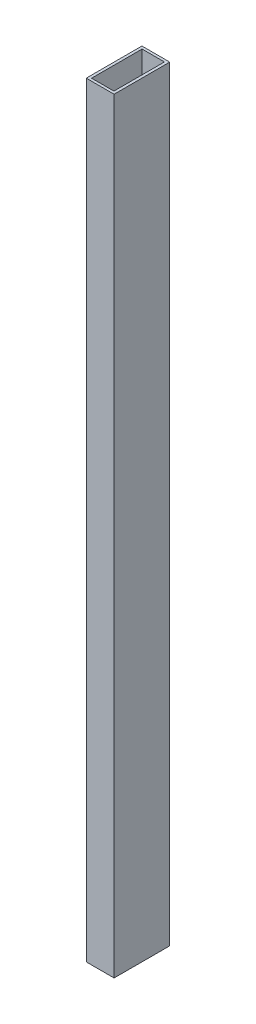
ISO-10303-21;
HEADER;
FILE_DESCRIPTION(('STEP AP214'),'2;1');
FILE_NAME('part.step','',(''),(''),'','','');
FILE_SCHEMA(('AUTOMOTIVE_DESIGN { 1 0 10303 214 1 1 1 1 }'));
ENDSEC;
DATA;
#1=APPLICATION_CONTEXT('core data for automotive mechanical design processes');
#2=APPLICATION_PROTOCOL_DEFINITION('international standard','automotive_design',2000,#1);
#3=PRODUCT_CONTEXT('',#1,'mechanical');
#4=PRODUCT('Part','Part','',(#3));
#5=PRODUCT_RELATED_PRODUCT_CATEGORY('part','',(#4));
#6=PRODUCT_DEFINITION_FORMATION('','',#4);
#7=PRODUCT_DEFINITION_CONTEXT('part definition',#1,'design');
#8=PRODUCT_DEFINITION('design','',#6,#7);
#9=PRODUCT_DEFINITION_SHAPE('','',#8);
#10=(LENGTH_UNIT() NAMED_UNIT(*) SI_UNIT(.MILLI.,.METRE.));
#11=(NAMED_UNIT(*) PLANE_ANGLE_UNIT() SI_UNIT($,.RADIAN.));
#12=(NAMED_UNIT(*) SI_UNIT($,.STERADIAN.) SOLID_ANGLE_UNIT());
#13=UNCERTAINTY_MEASURE_WITH_UNIT(LENGTH_MEASURE(1.E-05),#10,'distance_accuracy_value','');
#14=(GEOMETRIC_REPRESENTATION_CONTEXT(3) GLOBAL_UNCERTAINTY_ASSIGNED_CONTEXT((#13)) GLOBAL_UNIT_ASSIGNED_CONTEXT((#10,
#11,#12)) REPRESENTATION_CONTEXT('',''));
#15=CARTESIAN_POINT('',(0.,0.,0.));
#16=DIRECTION('',(0.,0.,1.));
#17=DIRECTION('',(1.,0.,0.));
#18=AXIS2_PLACEMENT_3D('',#15,#16,#17);
#19=CARTESIAN_POINT('',(0.,698.5,0.));
#20=DIRECTION('',(0.,-1.,0.));
#21=DIRECTION('',(0.,0.,-1.));
#22=AXIS2_PLACEMENT_3D('',#19,#20,#21);
#23=PLANE('',#22);
#24=DIRECTION('',(0.,0.,-1.));
#25=VECTOR('',#24,1.);
#26=CARTESIAN_POINT('',(15.4285360824743,698.5,25.104006109202));
#27=LINE('',#26,#25);
#28=CARTESIAN_POINT('',(15.4285360824743,698.5,25.104006109202));
#29=VERTEX_POINT('',#28);
#30=CARTESIAN_POINT('',(15.4285360824743,698.5,-25.695993890798));
#31=VERTEX_POINT('',#30);
#32=EDGE_CURVE('E173',#29,#31,#27,.T.);
#33=ORIENTED_EDGE('',*,*,#32,.T.);
#34=DIRECTION('',(-1.,0.,0.));
#35=VECTOR('',#34,1.);
#36=CARTESIAN_POINT('',(-9.97146391752574,698.5,-25.695993890798));
#37=LINE('',#36,#35);
#38=CARTESIAN_POINT('',(-9.97146391752574,698.5,-25.695993890798));
#39=VERTEX_POINT('',#38);
#40=EDGE_CURVE('E120',#31,#39,#37,.T.);
#41=ORIENTED_EDGE('',*,*,#40,.T.);
#42=DIRECTION('',(0.,0.,1.));
#43=VECTOR('',#42,1.);
#44=CARTESIAN_POINT('',(-9.97146391752574,698.5,25.104006109202));
#45=LINE('',#44,#43);
#46=CARTESIAN_POINT('',(-9.97146391752574,698.5,25.104006109202));
#47=VERTEX_POINT('',#46);
#48=EDGE_CURVE('E176',#39,#47,#45,.T.);
#49=ORIENTED_EDGE('',*,*,#48,.T.);
#50=DIRECTION('',(1.,0.,0.));
#51=VECTOR('',#50,1.);
#52=CARTESIAN_POINT('',(-9.97146391752574,698.5,25.104006109202));
#53=LINE('',#52,#51);
#54=EDGE_CURVE('E91',#47,#29,#53,.T.);
#55=ORIENTED_EDGE('',*,*,#54,.T.);
#56=EDGE_LOOP('',(#33,#41,#49,#55));
#57=FACE_BOUND('',#56,.T.);
#58=DIRECTION('',(0.,0.,-1.));
#59=VECTOR('',#58,1.);
#60=CARTESIAN_POINT('',(12.9079329813631,698.5,0.));
#61=LINE('',#60,#59);
#62=CARTESIAN_POINT('',(12.9079329813631,698.5,22.7317882900888));
#63=VERTEX_POINT('',#62);
#64=CARTESIAN_POINT('',(12.9079329813631,698.5,-23.3858455277616));
#65=VERTEX_POINT('',#64);
#66=EDGE_CURVE('E12',#63,#65,#61,.T.);
#67=ORIENTED_EDGE('',*,*,#66,.F.);
#68=DIRECTION('',(1.,0.,0.));
#69=VECTOR('',#68,1.);
#70=CARTESIAN_POINT('',(0.,698.5,22.7317882900888));
#71=LINE('',#70,#69);
#72=CARTESIAN_POINT('',(-7.51293012600225,698.5,22.7317882900888));
#73=VERTEX_POINT('',#72);
#74=EDGE_CURVE('E196',#73,#63,#71,.T.);
#75=ORIENTED_EDGE('',*,*,#74,.F.);
#76=DIRECTION('',(0.,0.,1.));
#77=VECTOR('',#76,1.);
#78=CARTESIAN_POINT('',(-7.51293012600225,698.5,0.));
#79=LINE('',#78,#77);
#80=CARTESIAN_POINT('',(-7.51293012600225,698.5,-23.3858455277616));
#81=VERTEX_POINT('',#80);
#82=EDGE_CURVE('E198',#81,#73,#79,.T.);
#83=ORIENTED_EDGE('',*,*,#82,.F.);
#84=DIRECTION('',(-1.,0.,0.));
#85=VECTOR('',#84,1.);
#86=CARTESIAN_POINT('',(0.,698.5,-23.3858455277616));
#87=LINE('',#86,#85);
#88=EDGE_CURVE('E73',#65,#81,#87,.T.);
#89=ORIENTED_EDGE('',*,*,#88,.F.);
#90=EDGE_LOOP('',(#67,#75,#83,#89));
#91=FACE_BOUND('',#90,.T.);
#92=ADVANCED_FACE('F65',(#57,#91),#23,.F.);
#93=CARTESIAN_POINT('',(15.4285360824743,698.5,25.104006109202));
#94=DIRECTION('',(-1.,0.,0.));
#95=DIRECTION('',(0.,0.,1.));
#96=AXIS2_PLACEMENT_3D('',#93,#94,#95);
#97=PLANE('',#96);
#98=DIRECTION('',(0.,0.,-1.));
#99=VECTOR('',#98,1.);
#100=CARTESIAN_POINT('',(15.4285360824743,0.,25.104006109202));
#101=LINE('',#100,#99);
#102=CARTESIAN_POINT('',(15.4285360824743,0.,25.104006109202));
#103=VERTEX_POINT('',#102);
#104=CARTESIAN_POINT('',(15.4285360824743,0.,-25.695993890798));
#105=VERTEX_POINT('',#104);
#106=EDGE_CURVE('E151',#103,#105,#101,.T.);
#107=ORIENTED_EDGE('',*,*,#106,.T.);
#108=DIRECTION('',(0.,-1.,0.));
#109=VECTOR('',#108,1.);
#110=CARTESIAN_POINT('',(15.4285360824743,698.5,-25.695993890798));
#111=LINE('',#110,#109);
#112=EDGE_CURVE('E194',#31,#105,#111,.T.);
#113=ORIENTED_EDGE('',*,*,#112,.F.);
#114=ORIENTED_EDGE('',*,*,#32,.F.);
#115=DIRECTION('',(0.,-1.,0.));
#116=VECTOR('',#115,1.);
#117=CARTESIAN_POINT('',(15.4285360824743,698.5,25.104006109202));
#118=LINE('',#117,#116);
#119=EDGE_CURVE('E179',#29,#103,#118,.T.);
#120=ORIENTED_EDGE('',*,*,#119,.T.);
#121=EDGE_LOOP('',(#107,#113,#114,#120));
#122=FACE_BOUND('',#121,.T.);
#123=ADVANCED_FACE('F67',(#122),#97,.F.);
#124=CARTESIAN_POINT('',(-9.97146391752574,698.5,-25.695993890798));
#125=DIRECTION('',(0.,0.,1.));
#126=DIRECTION('',(1.,0.,0.));
#127=AXIS2_PLACEMENT_3D('',#124,#125,#126);
#128=PLANE('',#127);
#129=DIRECTION('',(-1.,0.,0.));
#130=VECTOR('',#129,1.);
#131=CARTESIAN_POINT('',(-9.97146391752574,0.,-25.695993890798));
#132=LINE('',#131,#130);
#133=CARTESIAN_POINT('',(-9.97146391752574,0.,-25.695993890798));
#134=VERTEX_POINT('',#133);
#135=EDGE_CURVE('E182',#105,#134,#132,.T.);
#136=ORIENTED_EDGE('',*,*,#135,.T.);
#137=DIRECTION('',(0.,-1.,0.));
#138=VECTOR('',#137,1.);
#139=CARTESIAN_POINT('',(-9.97146391752574,698.5,-25.695993890798));
#140=LINE('',#139,#138);
#141=EDGE_CURVE('E191',#39,#134,#140,.T.);
#142=ORIENTED_EDGE('',*,*,#141,.F.);
#143=ORIENTED_EDGE('',*,*,#40,.F.);
#144=ORIENTED_EDGE('',*,*,#112,.T.);
#145=EDGE_LOOP('',(#136,#142,#143,#144));
#146=FACE_BOUND('',#145,.T.);
#147=ADVANCED_FACE('F218',(#146),#128,.F.);
#148=CARTESIAN_POINT('',(-9.97146391752574,698.5,25.104006109202));
#149=DIRECTION('',(1.,0.,0.));
#150=DIRECTION('',(0.,0.,-1.));
#151=AXIS2_PLACEMENT_3D('',#148,#149,#150);
#152=PLANE('',#151);
#153=DIRECTION('',(0.,0.,1.));
#154=VECTOR('',#153,1.);
#155=CARTESIAN_POINT('',(-9.97146391752574,0.,25.104006109202));
#156=LINE('',#155,#154);
#157=CARTESIAN_POINT('',(-9.97146391752574,0.,25.104006109202));
#158=VERTEX_POINT('',#157);
#159=EDGE_CURVE('E184',#134,#158,#156,.T.);
#160=ORIENTED_EDGE('',*,*,#159,.T.);
#161=DIRECTION('',(0.,-1.,0.));
#162=VECTOR('',#161,1.);
#163=CARTESIAN_POINT('',(-9.97146391752574,698.5,25.104006109202));
#164=LINE('',#163,#162);
#165=EDGE_CURVE('E189',#47,#158,#164,.T.);
#166=ORIENTED_EDGE('',*,*,#165,.F.);
#167=ORIENTED_EDGE('',*,*,#48,.F.);
#168=ORIENTED_EDGE('',*,*,#141,.T.);
#169=EDGE_LOOP('',(#160,#166,#167,#168));
#170=FACE_BOUND('',#169,.T.);
#171=ADVANCED_FACE('F230',(#170),#152,.F.);
#172=CARTESIAN_POINT('',(-9.97146391752574,698.5,25.104006109202));
#173=DIRECTION('',(0.,0.,-1.));
#174=DIRECTION('',(-1.,0.,0.));
#175=AXIS2_PLACEMENT_3D('',#172,#173,#174);
#176=PLANE('',#175);
#177=DIRECTION('',(1.,0.,0.));
#178=VECTOR('',#177,1.);
#179=CARTESIAN_POINT('',(-9.97146391752574,0.,25.104006109202));
#180=LINE('',#179,#178);
#181=EDGE_CURVE('E112',#158,#103,#180,.T.);
#182=ORIENTED_EDGE('',*,*,#181,.T.);
#183=ORIENTED_EDGE('',*,*,#119,.F.);
#184=ORIENTED_EDGE('',*,*,#54,.F.);
#185=ORIENTED_EDGE('',*,*,#165,.T.);
#186=EDGE_LOOP('',(#182,#183,#184,#185));
#187=FACE_BOUND('',#186,.T.);
#188=ADVANCED_FACE('F226',(#187),#176,.F.);
#189=CARTESIAN_POINT('',(0.,0.,0.));
#190=DIRECTION('',(0.,-1.,0.));
#191=DIRECTION('',(0.,0.,-1.));
#192=AXIS2_PLACEMENT_3D('',#189,#190,#191);
#193=PLANE('',#192);
#194=ORIENTED_EDGE('',*,*,#106,.F.);
#195=ORIENTED_EDGE('',*,*,#181,.F.);
#196=ORIENTED_EDGE('',*,*,#159,.F.);
#197=ORIENTED_EDGE('',*,*,#135,.F.);
#198=EDGE_LOOP('',(#194,#195,#196,#197));
#199=FACE_BOUND('',#198,.T.);
#200=ADVANCED_FACE('F223',(#199),#193,.T.);
#201=CARTESIAN_POINT('',(12.9079329813631,708.5,22.7317882900888));
#202=DIRECTION('',(-1.,0.,0.));
#203=DIRECTION('',(0.,0.,1.));
#204=AXIS2_PLACEMENT_3D('',#201,#202,#203);
#205=PLANE('',#204);
#206=ORIENTED_EDGE('',*,*,#66,.T.);
#207=DIRECTION('',(0.,-1.,0.));
#208=VECTOR('',#207,1.);
#209=CARTESIAN_POINT('',(12.9079329813631,708.5,-23.3858455277616));
#210=LINE('',#209,#208);
#211=CARTESIAN_POINT('',(12.9079329813631,190.5,-23.3858455277616));
#212=VERTEX_POINT('',#211);
#213=EDGE_CURVE('E141',#65,#212,#210,.T.);
#214=ORIENTED_EDGE('',*,*,#213,.T.);
#215=DIRECTION('',(0.,0.,-1.));
#216=VECTOR('',#215,1.);
#217=CARTESIAN_POINT('',(12.9079329813631,190.5,22.7317882900888));
#218=LINE('',#217,#216);
#219=CARTESIAN_POINT('',(12.9079329813631,190.5,22.7317882900888));
#220=VERTEX_POINT('',#219);
#221=EDGE_CURVE('E146',#220,#212,#218,.T.);
#222=ORIENTED_EDGE('',*,*,#221,.F.);
#223=DIRECTION('',(0.,-1.,0.));
#224=VECTOR('',#223,1.);
#225=CARTESIAN_POINT('',(12.9079329813631,708.5,22.7317882900888));
#226=LINE('',#225,#224);
#227=EDGE_CURVE('E169',#63,#220,#226,.T.);
#228=ORIENTED_EDGE('',*,*,#227,.F.);
#229=EDGE_LOOP('',(#206,#214,#222,#228));
#230=FACE_BOUND('',#229,.T.);
#231=ADVANCED_FACE('F143',(#230),#205,.T.);
#232=CARTESIAN_POINT('',(-7.51293012600225,708.5,-23.3858455277616));
#233=DIRECTION('',(0.,0.,1.));
#234=DIRECTION('',(1.,0.,0.));
#235=AXIS2_PLACEMENT_3D('',#232,#233,#234);
#236=PLANE('',#235);
#237=ORIENTED_EDGE('',*,*,#88,.T.);
#238=DIRECTION('',(0.,-1.,0.));
#239=VECTOR('',#238,1.);
#240=CARTESIAN_POINT('',(-7.51293012600225,708.5,-23.3858455277616));
#241=LINE('',#240,#239);
#242=CARTESIAN_POINT('',(-7.51293012600225,190.5,-23.3858455277616));
#243=VERTEX_POINT('',#242);
#244=EDGE_CURVE('E152',#81,#243,#241,.T.);
#245=ORIENTED_EDGE('',*,*,#244,.T.);
#246=DIRECTION('',(-1.,0.,0.));
#247=VECTOR('',#246,1.);
#248=CARTESIAN_POINT('',(-7.51293012600225,190.5,-23.3858455277616));
#249=LINE('',#248,#247);
#250=EDGE_CURVE('E155',#212,#243,#249,.T.);
#251=ORIENTED_EDGE('',*,*,#250,.F.);
#252=ORIENTED_EDGE('',*,*,#213,.F.);
#253=EDGE_LOOP('',(#237,#245,#251,#252));
#254=FACE_BOUND('',#253,.T.);
#255=ADVANCED_FACE('F156',(#254),#236,.T.);
#256=CARTESIAN_POINT('',(-7.51293012600225,708.5,22.7317882900888));
#257=DIRECTION('',(1.,0.,0.));
#258=DIRECTION('',(0.,0.,-1.));
#259=AXIS2_PLACEMENT_3D('',#256,#257,#258);
#260=PLANE('',#259);
#261=ORIENTED_EDGE('',*,*,#82,.T.);
#262=DIRECTION('',(0.,-1.,0.));
#263=VECTOR('',#262,1.);
#264=CARTESIAN_POINT('',(-7.51293012600225,708.5,22.7317882900888));
#265=LINE('',#264,#263);
#266=CARTESIAN_POINT('',(-7.51293012600225,190.5,22.7317882900888));
#267=VERTEX_POINT('',#266);
#268=EDGE_CURVE('E80',#73,#267,#265,.T.);
#269=ORIENTED_EDGE('',*,*,#268,.T.);
#270=DIRECTION('',(0.,0.,1.));
#271=VECTOR('',#270,1.);
#272=CARTESIAN_POINT('',(-7.51293012600225,190.5,22.7317882900888));
#273=LINE('',#272,#271);
#274=EDGE_CURVE('E161',#243,#267,#273,.T.);
#275=ORIENTED_EDGE('',*,*,#274,.F.);
#276=ORIENTED_EDGE('',*,*,#244,.F.);
#277=EDGE_LOOP('',(#261,#269,#275,#276));
#278=FACE_BOUND('',#277,.T.);
#279=ADVANCED_FACE('F202',(#278),#260,.T.);
#280=CARTESIAN_POINT('',(-7.51293012600225,708.5,22.7317882900888));
#281=DIRECTION('',(0.,0.,-1.));
#282=DIRECTION('',(-1.,0.,0.));
#283=AXIS2_PLACEMENT_3D('',#280,#281,#282);
#284=PLANE('',#283);
#285=ORIENTED_EDGE('',*,*,#74,.T.);
#286=ORIENTED_EDGE('',*,*,#227,.T.);
#287=DIRECTION('',(1.,0.,0.));
#288=VECTOR('',#287,1.);
#289=CARTESIAN_POINT('',(-7.51293012600225,190.5,22.7317882900888));
#290=LINE('',#289,#288);
#291=EDGE_CURVE('E164',#267,#220,#290,.T.);
#292=ORIENTED_EDGE('',*,*,#291,.F.);
#293=ORIENTED_EDGE('',*,*,#268,.F.);
#294=EDGE_LOOP('',(#285,#286,#292,#293));
#295=FACE_BOUND('',#294,.T.);
#296=ADVANCED_FACE('F204',(#295),#284,.T.);
#297=CARTESIAN_POINT('',(0.,190.5,0.));
#298=DIRECTION('',(0.,-1.,0.));
#299=DIRECTION('',(0.,0.,-1.));
#300=AXIS2_PLACEMENT_3D('',#297,#298,#299);
#301=PLANE('',#300);
#302=ORIENTED_EDGE('',*,*,#221,.T.);
#303=ORIENTED_EDGE('',*,*,#250,.T.);
#304=ORIENTED_EDGE('',*,*,#274,.T.);
#305=ORIENTED_EDGE('',*,*,#291,.T.);
#306=EDGE_LOOP('',(#302,#303,#304,#305));
#307=FACE_BOUND('',#306,.T.);
#308=ADVANCED_FACE('F163',(#307),#301,.F.);
#309=CLOSED_SHELL('',(#92,#123,#147,#171,#188,#200,#231,#255,#279,#296,#308));
#310=MANIFOLD_SOLID_BREP('B2',#309);
#311=ADVANCED_BREP_SHAPE_REPRESENTATION('',(#18,#310),#14);
#312=SHAPE_DEFINITION_REPRESENTATION(#9,#311);
ENDSEC;
END-ISO-10303-21;
